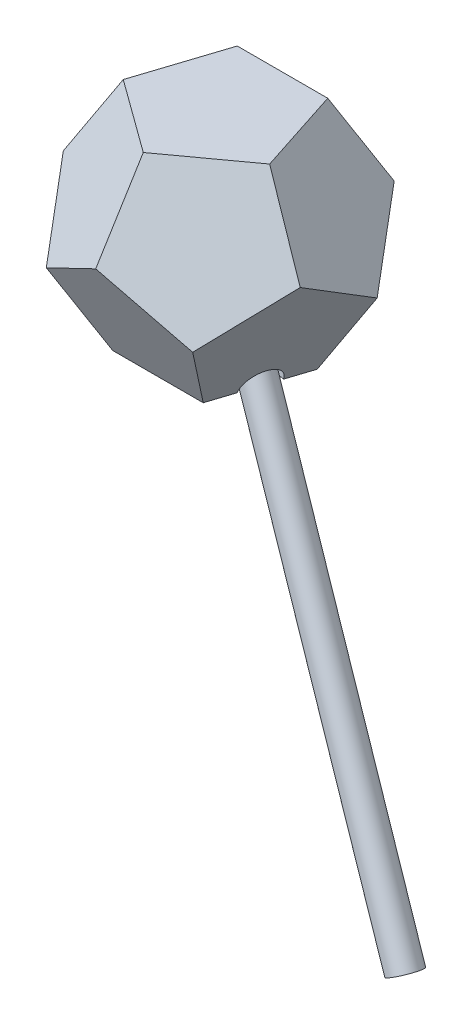
ISO-10303-21;
HEADER;
FILE_DESCRIPTION(('STEP AP214'),'2;1');
FILE_NAME('part.step','',(''),(''),'','','');
FILE_SCHEMA(('AUTOMOTIVE_DESIGN { 1 0 10303 214 1 1 1 1 }'));
ENDSEC;
DATA;
#1=APPLICATION_CONTEXT('core data for automotive mechanical design processes');
#2=APPLICATION_PROTOCOL_DEFINITION('international standard','automotive_design',2000,#1);
#3=PRODUCT_CONTEXT('',#1,'mechanical');
#4=PRODUCT('Part','Part','',(#3));
#5=PRODUCT_RELATED_PRODUCT_CATEGORY('part','',(#4));
#6=PRODUCT_DEFINITION_FORMATION('','',#4);
#7=PRODUCT_DEFINITION_CONTEXT('part definition',#1,'design');
#8=PRODUCT_DEFINITION('design','',#6,#7);
#9=PRODUCT_DEFINITION_SHAPE('','',#8);
#10=(LENGTH_UNIT() NAMED_UNIT(*) SI_UNIT(.MILLI.,.METRE.));
#11=(NAMED_UNIT(*) PLANE_ANGLE_UNIT() SI_UNIT($,.RADIAN.));
#12=(NAMED_UNIT(*) SI_UNIT($,.STERADIAN.) SOLID_ANGLE_UNIT());
#13=UNCERTAINTY_MEASURE_WITH_UNIT(LENGTH_MEASURE(1.E-05),#10,'distance_accuracy_value','');
#14=(GEOMETRIC_REPRESENTATION_CONTEXT(3) GLOBAL_UNCERTAINTY_ASSIGNED_CONTEXT((#13)) GLOBAL_UNIT_ASSIGNED_CONTEXT((#10,
#11,#12)) REPRESENTATION_CONTEXT('',''));
#15=CARTESIAN_POINT('',(0.,0.,0.));
#16=DIRECTION('',(0.,0.,1.));
#17=DIRECTION('',(1.,0.,0.));
#18=AXIS2_PLACEMENT_3D('',#15,#16,#17);
#19=CARTESIAN_POINT('',(-4.40860718489912,29.773572923928,-1.43244330732762));
#20=DIRECTION('',(0.499965060818532,-0.85067351211223,0.162448495688223));
#21=DIRECTION('',(0.862125098759777,0.506695484574754,0.));
#22=AXIS2_PLACEMENT_3D('',#19,#20,#21);
#23=PLANE('',#22);
#24=CARTESIAN_POINT('',(-4.40860718489912,29.773572923928,-1.43244330732762));
#25=DIRECTION('',(0.499965060818532,-0.85067351211223,0.162448495688223));
#26=DIRECTION('',(0.862125098759777,0.506695484574754,0.));
#27=AXIS2_PLACEMENT_3D('',#24,#25,#26);
#28=CIRCLE('',#27,4.05);
#29=CARTESIAN_POINT('',(-0.917000534922026,31.8256896364558,-1.43244330732762));
#30=VERTEX_POINT('',#29);
#31=EDGE_CURVE('E129',#30,#30,#28,.T.);
#32=ORIENTED_EDGE('',*,*,#31,.T.);
#33=EDGE_LOOP('',(#32));
#34=FACE_BOUND('',#33,.T.);
#35=CARTESIAN_POINT('',(-4.40860718489914,29.7735729239281,-1.43244330732762));
#36=DIRECTION('',(0.499965060818532,-0.850673512112229,0.162448495688223));
#37=DIRECTION('',(0.862125098759777,0.506695484574754,0.));
#38=AXIS2_PLACEMENT_3D('',#35,#36,#37);
#39=CIRCLE('',#38,3.29278811926631);
#40=CARTESIAN_POINT('',(-7.24740246741662,28.1051320522344,-1.43244330732762));
#41=VERTEX_POINT('',#40);
#42=EDGE_CURVE('E215',#41,#41,#39,.T.);
#43=ORIENTED_EDGE('',*,*,#42,.F.);
#44=EDGE_LOOP('',(#43));
#45=FACE_BOUND('',#44,.T.);
#46=ADVANCED_FACE('F37',(#34,#45),#23,.T.);
#47=CARTESIAN_POINT('',(16.1803398874989,0.,-5.25731112119136));
#48=DIRECTION('',(0.52570840560463,-0.447290848418711,-0.723575544913941));
#49=DIRECTION('',(-0.809016994374948,0.,-0.587785252292472));
#50=AXIS2_PLACEMENT_3D('',#47,#48,#49);
#51=PLANE('',#50);
#52=DIRECTION('',(-0.809065269261794,-0.525648973109098,-0.262881241521131));
#53=VECTOR('',#52,1.);
#54=CARTESIAN_POINT('',(8.09308247760691,22.2714192217847,-24.9005139598941));
#55=LINE('',#54,#53);
#56=CARTESIAN_POINT('',(16.1817960964732,27.5266491384143,-22.2723315879372));
#57=VERTEX_POINT('',#56);
#58=CARTESIAN_POINT('',(0.,17.0133508615857,-27.530115860106));
#59=VERTEX_POINT('',#58);
#60=EDGE_CURVE('E176',#57,#59,#55,.T.);
#61=ORIENTED_EDGE('',*,*,#60,.F.);
#62=DIRECTION('',(-0.500029835520881,0.525648973109087,-0.688232025307107));
#63=VECTOR('',#62,1.);
#64=CARTESIAN_POINT('',(29.2720315084894,13.7657326624709,-4.25516823212668));
#65=LINE('',#64,#63);
#66=CARTESIAN_POINT('',(26.1826960831143,17.0133508615857,-8.50727365788405));
#67=VERTEX_POINT('',#66);
#68=EDGE_CURVE('E180',#67,#57,#65,.T.);
#69=ORIENTED_EDGE('',*,*,#68,.F.);
#70=DIRECTION('',(-0.500078121722083,-0.850600036298457,0.162485231402662));
#71=VECTOR('',#70,1.);
#72=CARTESIAN_POINT('',(16.1803398874989,0.,-5.25731112119136));
#73=LINE('',#72,#71);
#74=CARTESIAN_POINT('',(16.1803398874989,0.,-5.25731112119136));
#75=VERTEX_POINT('',#74);
#76=EDGE_CURVE('E138',#67,#75,#73,.T.);
#77=ORIENTED_EDGE('',*,*,#76,.T.);
#78=DIRECTION('',(-0.809016994374948,0.,-0.587785252292472));
#79=VECTOR('',#78,1.);
#80=CARTESIAN_POINT('',(16.1803398874989,0.,-5.25731112119136));
#81=LINE('',#80,#79);
#82=CARTESIAN_POINT('',(0.,0.,-17.0130161670408));
#83=VERTEX_POINT('',#82);
#84=EDGE_CURVE('E135',#75,#83,#81,.T.);
#85=ORIENTED_EDGE('',*,*,#84,.T.);
#86=DIRECTION('',(0.,-0.850600036298457,0.525813254158796));
#87=VECTOR('',#86,1.);
#88=CARTESIAN_POINT('',(0.,0.,-17.0130161670408));
#89=LINE('',#88,#87);
#90=EDGE_CURVE('E45',#59,#83,#89,.T.);
#91=ORIENTED_EDGE('',*,*,#90,.F.);
#92=EDGE_LOOP('',(#61,#69,#77,#85,#91));
#93=FACE_BOUND('',#92,.T.);
#94=ADVANCED_FACE('F230',(#93),#51,.T.);
#95=CARTESIAN_POINT('',(0.,0.,-17.0130161670408));
#96=DIRECTION('',(-0.525708405604632,-0.447290848418711,-0.72357554491394));
#97=DIRECTION('',(-0.809016994374947,0.,0.587785252292474));
#98=AXIS2_PLACEMENT_3D('',#95,#96,#97);
#99=PLANE('',#98);
#100=DIRECTION('',(-0.500029835520869,-0.525648973109098,0.688232025307108));
#101=VECTOR('',#100,1.);
#102=CARTESIAN_POINT('',(-21.1808960381971,22.2714192217847,-15.3916608095201));
#103=LINE('',#102,#101);
#104=CARTESIAN_POINT('',(-16.1817960964736,27.5266491384143,-22.2723315879368));
#105=VERTEX_POINT('',#104);
#106=CARTESIAN_POINT('',(-26.1826960831143,17.0133508615857,-8.50727365788398));
#107=VERTEX_POINT('',#106);
#108=EDGE_CURVE('E173',#105,#107,#103,.T.);
#109=ORIENTED_EDGE('',*,*,#108,.F.);
#110=DIRECTION('',(-0.809065269261797,0.525648973109087,0.262881241521143));
#111=VECTOR('',#110,1.);
#112=CARTESIAN_POINT('',(4.99864972090595,13.765732662471,-29.1542756089975));
#113=LINE('',#112,#111);
#114=EDGE_CURVE('E178',#59,#105,#113,.T.);
#115=ORIENTED_EDGE('',*,*,#114,.F.);
#116=ORIENTED_EDGE('',*,*,#90,.T.);
#117=DIRECTION('',(-0.809016994374947,0.,0.587785252292474));
#118=VECTOR('',#117,1.);
#119=CARTESIAN_POINT('',(0.,0.,-17.0130161670408));
#120=LINE('',#119,#118);
#121=CARTESIAN_POINT('',(-16.180339887499,0.,-5.25731112119131));
#122=VERTEX_POINT('',#121);
#123=EDGE_CURVE('E163',#83,#122,#120,.T.);
#124=ORIENTED_EDGE('',*,*,#123,.T.);
#125=DIRECTION('',(0.500078121722083,-0.850600036298458,0.162485231402661));
#126=VECTOR('',#125,1.);
#127=CARTESIAN_POINT('',(-16.180339887499,0.,-5.25731112119131));
#128=LINE('',#127,#126);
#129=EDGE_CURVE('E145',#107,#122,#128,.T.);
#130=ORIENTED_EDGE('',*,*,#129,.F.);
#131=EDGE_LOOP('',(#109,#115,#116,#124,#130));
#132=FACE_BOUND('',#131,.T.);
#133=ADVANCED_FACE('F39',(#132),#99,.T.);
#134=CARTESIAN_POINT('',(-16.180339887499,0.,-5.25731112119131));
#135=DIRECTION('',(-0.850614068439808,-0.447290848418711,0.2763812647289));
#136=DIRECTION('',(0.465419848908712,-0.8850900317153,0.));
#137=AXIS2_PLACEMENT_3D('',#134,#135,#136);
#138=PLANE('',#137);
#139=DIRECTION('',(0.500029835520878,-0.525648973109097,0.688232025307102));
#140=VECTOR('',#139,1.);
#141=CARTESIAN_POINT('',(-21.1835961413907,22.2714192217847,15.387944436301));
#142=LINE('',#141,#140);
#143=CARTESIAN_POINT('',(-26.1826960831142,27.5266491384143,8.50727365788428));
#144=VERTEX_POINT('',#143);
#145=CARTESIAN_POINT('',(-16.1817960964734,17.0133508615857,22.272331587937));
#146=VERTEX_POINT('',#145);
#147=EDGE_CURVE('E169',#144,#146,#142,.T.);
#148=ORIENTED_EDGE('',*,*,#147,.F.);
#149=DIRECTION('',(0.,0.525648973109087,0.850701567571944));
#150=VECTOR('',#149,1.);
#151=CARTESIAN_POINT('',(-26.1826960831144,13.765732662471,-13.7631650116158));
#152=LINE('',#151,#150);
#153=EDGE_CURVE('E160',#107,#144,#152,.T.);
#154=ORIENTED_EDGE('',*,*,#153,.F.);
#155=ORIENTED_EDGE('',*,*,#129,.T.);
#156=DIRECTION('',(0.309016994374949,0.,0.951056516295153));
#157=VECTOR('',#156,1.);
#158=CARTESIAN_POINT('',(-16.180339887499,0.,-5.25731112119131));
#159=LINE('',#158,#157);
#160=CARTESIAN_POINT('',(-9.99999999999998,0.,13.7638192047118));
#161=VERTEX_POINT('',#160);
#162=EDGE_CURVE('E140',#122,#161,#159,.T.);
#163=ORIENTED_EDGE('',*,*,#162,.T.);
#164=DIRECTION('',(0.309065276254454,-0.850600036298457,-0.42539185848206));
#165=VECTOR('',#164,1.);
#166=CARTESIAN_POINT('',(-9.99999999999998,0.,13.7638192047118));
#167=LINE('',#166,#165);
#168=EDGE_CURVE('E149',#146,#161,#167,.T.);
#169=ORIENTED_EDGE('',*,*,#168,.F.);
#170=EDGE_LOOP('',(#148,#154,#155,#163,#169));
#171=FACE_BOUND('',#170,.T.);
#172=ADVANCED_FACE('F156',(#171),#138,.T.);
#173=CARTESIAN_POINT('',(-9.99999999999998,0.,13.7638192047118));
#174=DIRECTION('',(0.,-0.447290848418711,0.894388560370083));
#175=DIRECTION('',(0.,-0.894388560370083,-0.447290848418711));
#176=AXIS2_PLACEMENT_3D('',#173,#174,#175);
#177=PLANE('',#176);
#178=DIRECTION('',(0.8090652692618,0.525648973109087,0.262881241521133));
#179=VECTOR('',#178,1.);
#180=CARTESIAN_POINT('',(-21.1804458173794,13.7657326624709,20.6481718390456));
#181=LINE('',#180,#179);
#182=CARTESIAN_POINT('',(2.82325570167555E-13,27.5266491384143,27.530115860106));
#183=VERTEX_POINT('',#182);
#184=EDGE_CURVE('E171',#146,#183,#181,.T.);
#185=ORIENTED_EDGE('',*,*,#184,.F.);
#186=ORIENTED_EDGE('',*,*,#168,.T.);
#187=DIRECTION('',(1.,0.,0.));
#188=VECTOR('',#187,1.);
#189=CARTESIAN_POINT('',(-9.99999999999998,0.,13.7638192047118));
#190=LINE('',#189,#188);
#191=CARTESIAN_POINT('',(10.,0.,13.7638192047117));
#192=VERTEX_POINT('',#191);
#193=EDGE_CURVE('E136',#161,#192,#190,.T.);
#194=ORIENTED_EDGE('',*,*,#193,.T.);
#195=DIRECTION('',(-0.309065276254455,-0.850600036298457,-0.425391858482059));
#196=VECTOR('',#195,1.);
#197=CARTESIAN_POINT('',(10.,0.,13.7638192047117));
#198=LINE('',#197,#196);
#199=CARTESIAN_POINT('',(16.1817960964734,17.0133508615857,22.272331587937));
#200=VERTEX_POINT('',#199);
#201=EDGE_CURVE('E147',#200,#192,#198,.T.);
#202=ORIENTED_EDGE('',*,*,#201,.F.);
#203=DIRECTION('',(0.809065269261791,-0.525648973109097,-0.262881241521141));
#204=VECTOR('',#203,1.);
#205=CARTESIAN_POINT('',(8.0887136188665,22.2714192217847,24.9019334881489));
#206=LINE('',#205,#204);
#207=EDGE_CURVE('E58',#183,#200,#206,.T.);
#208=ORIENTED_EDGE('',*,*,#207,.F.);
#209=EDGE_LOOP('',(#185,#186,#194,#202,#208));
#210=FACE_BOUND('',#209,.T.);
#211=ADVANCED_FACE('F270',(#210),#177,.T.);
#212=CARTESIAN_POINT('',(10.,0.,13.7638192047117));
#213=DIRECTION('',(0.850614068439809,-0.447290848418711,0.276381264728898));
#214=DIRECTION('',(0.465419848908712,0.885090031715301,0.));
#215=AXIS2_PLACEMENT_3D('',#212,#213,#214);
#216=PLANE('',#215);
#217=DIRECTION('',(0.309016994374946,0.,-0.951056516295154));
#218=VECTOR('',#217,1.);
#219=CARTESIAN_POINT('',(10.,0.,13.7638192047117));
#220=LINE('',#219,#218);
#221=CARTESIAN_POINT('',(11.838651116531,0.,8.10503293275556));
#222=VERTEX_POINT('',#221);
#223=EDGE_CURVE('E127',#192,#222,#220,.T.);
#224=ORIENTED_EDGE('',*,*,#223,.T.);
#225=CARTESIAN_POINT('',(13.0901699437495,0.,4.25325404176018));
#226=DIRECTION('',(0.850614068439809,-0.447290848418711,0.276381264728898));
#227=DIRECTION('',(-0.425398876067803,-0.894388560370083,-0.13822047358977));
#228=AXIS2_PLACEMENT_3D('',#225,#226,#227);
#229=ELLIPSE('',#228,4.76093347486959,4.05);
#230=CARTESIAN_POINT('',(14.341688770968,0.,0.401475150764812));
#231=VERTEX_POINT('',#230);
#232=EDGE_CURVE('E51',#222,#231,#229,.F.);
#233=ORIENTED_EDGE('',*,*,#232,.T.);
#234=EDGE_CURVE('E125',#231,#75,#220,.T.);
#235=ORIENTED_EDGE('',*,*,#234,.T.);
#236=ORIENTED_EDGE('',*,*,#76,.F.);
#237=DIRECTION('',(0.,-0.525648973109097,-0.850701567571937));
#238=VECTOR('',#237,1.);
#239=CARTESIAN_POINT('',(26.1826960831144,22.2714192217847,0.00229684496430398));
#240=LINE('',#239,#238);
#241=CARTESIAN_POINT('',(26.1826960831144,27.5266491384143,8.50727365788375));
#242=VERTEX_POINT('',#241);
#243=EDGE_CURVE('E182',#242,#67,#240,.T.);
#244=ORIENTED_EDGE('',*,*,#243,.F.);
#245=DIRECTION('',(0.500029835520873,0.525648973109087,-0.688232025307113));
#246=VECTOR('',#245,1.);
#247=CARTESIAN_POINT('',(13.0924606710984,13.7657326624709,26.5244370136944));
#248=LINE('',#247,#246);
#249=EDGE_CURVE('E185',#200,#242,#248,.T.);
#250=ORIENTED_EDGE('',*,*,#249,.F.);
#251=ORIENTED_EDGE('',*,*,#201,.T.);
#252=EDGE_LOOP('',(#224,#233,#235,#236,#244,#250,#251));
#253=FACE_BOUND('',#252,.T.);
#254=ADVANCED_FACE('F123',(#253),#216,.T.);
#255=CARTESIAN_POINT('',(0.,0.,0.));
#256=DIRECTION('',(0.,1.,0.));
#257=DIRECTION('',(0.,0.,1.));
#258=AXIS2_PLACEMENT_3D('',#255,#256,#257);
#259=PLANE('',#258);
#260=ORIENTED_EDGE('',*,*,#234,.F.);
#261=CARTESIAN_POINT('',(13.0901699437495,0.,4.25325404176018));
#262=DIRECTION('',(0.,1.,0.));
#263=DIRECTION('',(0.951056516295154,0.,0.309016994374946));
#264=AXIS2_PLACEMENT_3D('',#261,#262,#263);
#265=ELLIPSE('',#264,4.76093347486959,4.05);
#266=EDGE_CURVE('E12',#231,#222,#265,.T.);
#267=ORIENTED_EDGE('',*,*,#266,.T.);
#268=ORIENTED_EDGE('',*,*,#223,.F.);
#269=ORIENTED_EDGE('',*,*,#193,.F.);
#270=ORIENTED_EDGE('',*,*,#162,.F.);
#271=ORIENTED_EDGE('',*,*,#123,.F.);
#272=ORIENTED_EDGE('',*,*,#84,.F.);
#273=EDGE_LOOP('',(#260,#267,#268,#269,#270,#271,#272));
#274=FACE_BOUND('',#273,.T.);
#275=ADVANCED_FACE('F132',(#274),#259,.F.);
#276=CARTESIAN_POINT('',(-16.1803398874989,44.54,5.25731112119151));
#277=DIRECTION('',(0.525708405604624,-0.447290848418711,-0.723575544913946));
#278=DIRECTION('',(-0.809016994374953,0.,-0.587785252292465));
#279=AXIS2_PLACEMENT_3D('',#276,#277,#278);
#280=PLANE('',#279);
#281=ORIENTED_EDGE('',*,*,#147,.T.);
#282=ORIENTED_EDGE('',*,*,#184,.T.);
#283=DIRECTION('',(0.,0.850600036298457,-0.525813254158796));
#284=VECTOR('',#283,1.);
#285=CARTESIAN_POINT('',(1.42247325030098E-13,49.7978187040126,13.762803793944));
#286=LINE('',#285,#284);
#287=CARTESIAN_POINT('',(1.75207071073658E-13,44.54,17.0130161670408));
#288=VERTEX_POINT('',#287);
#289=EDGE_CURVE('E192',#183,#288,#286,.T.);
#290=ORIENTED_EDGE('',*,*,#289,.T.);
#291=DIRECTION('',(0.809016994374953,0.,0.587785252292465));
#292=VECTOR('',#291,1.);
#293=CARTESIAN_POINT('',(-16.1803398874989,44.54,5.25731112119151));
#294=LINE('',#293,#292);
#295=CARTESIAN_POINT('',(-16.1803398874989,44.54,5.25731112119151));
#296=VERTEX_POINT('',#295);
#297=EDGE_CURVE('E128',#296,#288,#294,.T.);
#298=ORIENTED_EDGE('',*,*,#297,.F.);
#299=DIRECTION('',(0.500078121722081,0.850600036298457,-0.162485231402667));
#300=VECTOR('',#299,1.);
#301=CARTESIAN_POINT('',(-13.089204230722,49.7978187040126,4.25294026257682));
#302=LINE('',#301,#300);
#303=EDGE_CURVE('E187',#144,#296,#302,.T.);
#304=ORIENTED_EDGE('',*,*,#303,.F.);
#305=EDGE_LOOP('',(#281,#282,#290,#298,#304));
#306=FACE_BOUND('',#305,.T.);
#307=ADVANCED_FACE('F244',(#306),#280,.F.);
#308=CARTESIAN_POINT('',(-10.0000000000001,44.54,-13.7638192047116));
#309=DIRECTION('',(0.850614068439812,-0.447290848418711,0.27638126472889));
#310=DIRECTION('',(0.465419848908711,0.885090031715301,0.));
#311=AXIS2_PLACEMENT_3D('',#308,#309,#310);
#312=PLANE('',#311);
#313=ORIENTED_EDGE('',*,*,#108,.T.);
#314=ORIENTED_EDGE('',*,*,#153,.T.);
#315=ORIENTED_EDGE('',*,*,#303,.T.);
#316=DIRECTION('',(-0.309016994374937,0.,0.951056516295157));
#317=VECTOR('',#316,1.);
#318=CARTESIAN_POINT('',(-10.0000000000001,44.54,-13.7638192047116));
#319=LINE('',#318,#317);
#320=CARTESIAN_POINT('',(-10.0000000000001,44.54,-13.7638192047116));
#321=VERTEX_POINT('',#320);
#322=EDGE_CURVE('E198',#321,#296,#319,.T.);
#323=ORIENTED_EDGE('',*,*,#322,.F.);
#324=DIRECTION('',(0.309065276254459,0.850600036298457,0.425391858482056));
#325=VECTOR('',#324,1.);
#326=CARTESIAN_POINT('',(-8.08957310027528,49.7978187040126,-11.1343421595486));
#327=LINE('',#326,#325);
#328=EDGE_CURVE('E194',#105,#321,#327,.T.);
#329=ORIENTED_EDGE('',*,*,#328,.F.);
#330=EDGE_LOOP('',(#313,#314,#315,#323,#329));
#331=FACE_BOUND('',#330,.T.);
#332=ADVANCED_FACE('F247',(#331),#312,.F.);
#333=CARTESIAN_POINT('',(9.99999999999986,44.54,-13.7638192047118));
#334=DIRECTION('',(0.,-0.447290848418711,0.894388560370083));
#335=DIRECTION('',(0.,-0.894388560370083,-0.447290848418711));
#336=AXIS2_PLACEMENT_3D('',#333,#334,#335);
#337=PLANE('',#336);
#338=ORIENTED_EDGE('',*,*,#60,.T.);
#339=ORIENTED_EDGE('',*,*,#114,.T.);
#340=ORIENTED_EDGE('',*,*,#328,.T.);
#341=DIRECTION('',(-1.,0.,0.));
#342=VECTOR('',#341,1.);
#343=CARTESIAN_POINT('',(9.99999999999986,44.54,-13.7638192047118));
#344=LINE('',#343,#342);
#345=CARTESIAN_POINT('',(9.99999999999986,44.54,-13.7638192047118));
#346=VERTEX_POINT('',#345);
#347=EDGE_CURVE('E201',#346,#321,#344,.T.);
#348=ORIENTED_EDGE('',*,*,#347,.F.);
#349=DIRECTION('',(-0.30906527625445,0.850600036298457,0.425391858482063));
#350=VECTOR('',#349,1.);
#351=CARTESIAN_POINT('',(8.08957310027504,49.7978187040126,-11.1343421595488));
#352=LINE('',#351,#350);
#353=EDGE_CURVE('E191',#57,#346,#352,.T.);
#354=ORIENTED_EDGE('',*,*,#353,.F.);
#355=EDGE_LOOP('',(#338,#339,#340,#348,#354));
#356=FACE_BOUND('',#355,.T.);
#357=ADVANCED_FACE('F251',(#356),#337,.F.);
#358=CARTESIAN_POINT('',(16.180339887499,44.54,5.25731112119117));
#359=DIRECTION('',(-0.850614068439806,-0.447290848418711,0.276381264728908));
#360=DIRECTION('',(0.465419848908713,-0.8850900317153,0.));
#361=AXIS2_PLACEMENT_3D('',#358,#359,#360);
#362=PLANE('',#361);
#363=ORIENTED_EDGE('',*,*,#68,.T.);
#364=ORIENTED_EDGE('',*,*,#353,.T.);
#365=DIRECTION('',(-0.309016994374957,0.,-0.951056516295151));
#366=VECTOR('',#365,1.);
#367=CARTESIAN_POINT('',(16.180339887499,44.54,5.25731112119117));
#368=LINE('',#367,#366);
#369=CARTESIAN_POINT('',(16.180339887499,44.54,5.25731112119117));
#370=VERTEX_POINT('',#369);
#371=EDGE_CURVE('E204',#370,#346,#368,.T.);
#372=ORIENTED_EDGE('',*,*,#371,.F.);
#373=DIRECTION('',(-0.500078121722085,0.850600036298458,-0.162485231402656));
#374=VECTOR('',#373,1.);
#375=CARTESIAN_POINT('',(13.0892042307221,49.7978187040126,4.25294026257655));
#376=LINE('',#375,#374);
#377=EDGE_CURVE('E188',#242,#370,#376,.T.);
#378=ORIENTED_EDGE('',*,*,#377,.F.);
#379=ORIENTED_EDGE('',*,*,#243,.T.);
#380=EDGE_LOOP('',(#363,#364,#372,#378,#379));
#381=FACE_BOUND('',#380,.T.);
#382=ADVANCED_FACE('F255',(#381),#362,.F.);
#383=CARTESIAN_POINT('',(1.75207071073658E-13,44.54,17.0130161670408));
#384=DIRECTION('',(-0.525708405604639,-0.447290848418711,-0.723575544913935));
#385=DIRECTION('',(-0.809016994374941,0.,0.587785252292482));
#386=AXIS2_PLACEMENT_3D('',#383,#384,#385);
#387=PLANE('',#386);
#388=ORIENTED_EDGE('',*,*,#207,.T.);
#389=ORIENTED_EDGE('',*,*,#249,.T.);
#390=ORIENTED_EDGE('',*,*,#377,.T.);
#391=DIRECTION('',(0.809016994374941,0.,-0.587785252292482));
#392=VECTOR('',#391,1.);
#393=CARTESIAN_POINT('',(1.75207071073658E-13,44.54,17.0130161670408));
#394=LINE('',#393,#392);
#395=EDGE_CURVE('E207',#288,#370,#394,.T.);
#396=ORIENTED_EDGE('',*,*,#395,.F.);
#397=ORIENTED_EDGE('',*,*,#289,.F.);
#398=EDGE_LOOP('',(#388,#389,#390,#396,#397));
#399=FACE_BOUND('',#398,.T.);
#400=ADVANCED_FACE('F259',(#399),#387,.F.);
#401=CARTESIAN_POINT('',(0.,44.54,0.));
#402=DIRECTION('',(0.,1.,0.));
#403=DIRECTION('',(0.,0.,1.));
#404=AXIS2_PLACEMENT_3D('',#401,#402,#403);
#405=PLANE('',#404);
#406=ORIENTED_EDGE('',*,*,#322,.T.);
#407=ORIENTED_EDGE('',*,*,#297,.T.);
#408=ORIENTED_EDGE('',*,*,#395,.T.);
#409=ORIENTED_EDGE('',*,*,#371,.T.);
#410=ORIENTED_EDGE('',*,*,#347,.T.);
#411=EDGE_LOOP('',(#406,#407,#408,#409,#410));
#412=FACE_BOUND('',#411,.T.);
#413=ADVANCED_FACE('F242',(#412),#405,.T.);
#414=CARTESIAN_POINT('',(-4.40860718489912,29.773572923928,-1.43244330732762));
#415=DIRECTION('',(0.499965060818532,-0.85067351211223,0.162448495688223));
#416=DIRECTION('',(0.862125098759777,0.506695484574754,0.));
#417=AXIS2_PLACEMENT_3D('',#414,#415,#416);
#418=CYLINDRICAL_SURFACE('',#417,4.05);
#419=ORIENTED_EDGE('',*,*,#31,.F.);
#420=EDGE_LOOP('',(#419));
#421=FACE_BOUND('',#420,.T.);
#422=ORIENTED_EDGE('',*,*,#266,.F.);
#423=ORIENTED_EDGE('',*,*,#232,.F.);
#424=EDGE_LOOP('',(#422,#423));
#425=FACE_BOUND('',#424,.T.);
#426=ADVANCED_FACE('F117',(#421,#425),#418,.F.);
#427=CARTESIAN_POINT('',(60.58685072151,-80.8139836506618,19.6858611321414));
#428=DIRECTION('',(-0.499965060818532,0.850673512112229,-0.162448495688223));
#429=DIRECTION('',(-0.862125098759777,-0.506695484574754,0.));
#430=AXIS2_PLACEMENT_3D('',#427,#428,#429);
#431=CYLINDRICAL_SURFACE('',#430,3.29278811926631);
#432=CARTESIAN_POINT('',(60.58685072151,-80.8139836506618,19.6858611321414));
#433=DIRECTION('',(0.499965060818532,-0.850673512112229,0.162448495688223));
#434=DIRECTION('',(0.862125098759777,0.506695484574754,0.));
#435=AXIS2_PLACEMENT_3D('',#432,#433,#434);
#436=CIRCLE('',#435,3.29278811926631);
#437=CARTESIAN_POINT('',(57.7480554389925,-82.4824245223554,19.6858611321414));
#438=VERTEX_POINT('',#437);
#439=EDGE_CURVE('E214',#438,#438,#436,.T.);
#440=CARTESIAN_POINT('',(57.7480554389925,-82.4824245223554,19.6858611321414));
#441=CARTESIAN_POINT('',(57.0710194191341,-81.3304708080368,19.4658787942302));
#442=CARTESIAN_POINT('',(56.3939833992756,-80.1785170937181,19.2458964563191));
#443=CARTESIAN_POINT('',(55.0399113595588,-77.8746096650808,18.8059317804968));
#444=CARTESIAN_POINT('',(54.3628753397003,-76.7226559507622,18.5859494425857));
#445=CARTESIAN_POINT('',(53.0088032999835,-74.4187485221249,18.1459847667634));
#446=CARTESIAN_POINT('',(52.3317672801251,-73.2667948078063,17.9260024288523));
#447=CARTESIAN_POINT('',(50.9776952404082,-70.962887379169,17.48603775303));
#448=CARTESIAN_POINT('',(50.3006592205498,-69.8109336648503,17.2660554151189));
#449=CARTESIAN_POINT('',(48.9465871808329,-67.5070262362131,16.8260907392966));
#450=CARTESIAN_POINT('',(48.2695511609745,-66.3550725218944,16.6061084013855));
#451=CARTESIAN_POINT('',(46.9154791212576,-64.0511650932571,16.1661437255632));
#452=CARTESIAN_POINT('',(46.2384431013992,-62.8992113789385,15.9461613876521));
#453=CARTESIAN_POINT('',(44.8843710616824,-60.5953039503012,15.5061967118298));
#454=CARTESIAN_POINT('',(44.2073350418239,-59.4433502359825,15.2862143739187));
#455=CARTESIAN_POINT('',(42.8532630021071,-57.1394428073453,14.8462496980964));
#456=CARTESIAN_POINT('',(42.1762269822486,-55.9874890930266,14.6262673601852));
#457=CARTESIAN_POINT('',(40.8221549425318,-53.6835816643893,14.186302684363));
#458=CARTESIAN_POINT('',(40.1451189226733,-52.5316279500707,13.9663203464518));
#459=CARTESIAN_POINT('',(38.7910468829565,-50.2277205214334,13.5263556706296));
#460=CARTESIAN_POINT('',(38.1140108630981,-49.0757668071147,13.3063733327184));
#461=CARTESIAN_POINT('',(36.7599388233812,-46.7718593784775,12.8664086568962));
#462=CARTESIAN_POINT('',(36.0829028035228,-45.6199056641588,12.646426318985));
#463=CARTESIAN_POINT('',(34.7288307638059,-43.3159982355215,12.2064616431628));
#464=CARTESIAN_POINT('',(34.0517947439475,-42.1640445212029,11.9864793052516));
#465=CARTESIAN_POINT('',(32.6977227042306,-39.8601370925656,11.5465146294294));
#466=CARTESIAN_POINT('',(32.0206866843722,-38.708183378247,11.3265322915182));
#467=CARTESIAN_POINT('',(30.6666146446554,-36.4042759496097,10.8865676156959));
#468=CARTESIAN_POINT('',(29.9895786247969,-35.252322235291,10.6665852777848));
#469=CARTESIAN_POINT('',(28.6355065850801,-32.9484148066537,10.2266206019625));
#470=CARTESIAN_POINT('',(27.9584705652216,-31.7964610923351,10.0066382640514));
#471=CARTESIAN_POINT('',(26.6043985255048,-29.4925536636978,9.56667358822913));
#472=CARTESIAN_POINT('',(25.9273625056464,-28.3405999493792,9.346691250318));
#473=CARTESIAN_POINT('',(24.5732904659295,-26.0366925207419,8.90672657449573));
#474=CARTESIAN_POINT('',(23.8962544460711,-24.8847388064232,8.68674423658459));
#475=CARTESIAN_POINT('',(22.5421824063542,-22.5808313777859,8.24677956076233));
#476=CARTESIAN_POINT('',(21.8651463864958,-21.4288776634673,8.02679722285119));
#477=CARTESIAN_POINT('',(20.5110743467789,-19.12497023483,7.58683254702892));
#478=CARTESIAN_POINT('',(19.8340383269205,-17.9730165205114,7.36685020911778));
#479=CARTESIAN_POINT('',(18.4799662872036,-15.6691090918741,6.92688553329551));
#480=CARTESIAN_POINT('',(17.8029302673452,-14.5171553775554,6.70690319538438));
#481=CARTESIAN_POINT('',(16.4488582276284,-12.2132479489181,6.26693851956211));
#482=CARTESIAN_POINT('',(15.7718222077699,-11.0612942345995,6.04695618165097));
#483=CARTESIAN_POINT('',(14.4177501680531,-8.7573868059622,5.6069915058287));
#484=CARTESIAN_POINT('',(13.7407141481946,-7.60543309164355,5.38700916791757));
#485=CARTESIAN_POINT('',(12.3866421084778,-5.30152566300626,4.9470444920953));
#486=CARTESIAN_POINT('',(11.7096060886194,-4.14957194868762,4.72706215418416));
#487=CARTESIAN_POINT('',(10.3555340489025,-1.84566452005033,4.28709747836189));
#488=CARTESIAN_POINT('',(9.67849802904408,-0.69371080573169,4.06711514045076));
#489=CARTESIAN_POINT('',(8.32442598932723,1.6101966229056,3.62715046462849));
#490=CARTESIAN_POINT('',(7.6473899694688,2.76215033722424,3.40716812671735));
#491=CARTESIAN_POINT('',(6.29331792975195,5.06605776586153,2.96720345089508));
#492=CARTESIAN_POINT('',(5.61628190989352,6.21801148018017,2.74722111298395));
#493=CARTESIAN_POINT('',(4.26220987017666,8.52191890881745,2.30725643716168));
#494=CARTESIAN_POINT('',(3.58517385031823,9.6738726231361,2.08727409925054));
#495=CARTESIAN_POINT('',(2.23110181060137,11.9777800517734,1.64730942342827));
#496=CARTESIAN_POINT('',(1.55406579074294,13.129733766092,1.42732708551714));
#497=CARTESIAN_POINT('',(0.19999375102609,15.4336411947293,0.987362409694865));
#498=CARTESIAN_POINT('',(-0.477042268832341,16.585594909048,0.767380071783728));
#499=CARTESIAN_POINT('',(-1.8311143085492,18.8895023376852,0.327415395961456));
#500=CARTESIAN_POINT('',(-2.50815032840763,20.0414560520039,0.10743305805032));
#501=CARTESIAN_POINT('',(-3.86222236812448,22.3453634806412,-0.332531617771949));
#502=CARTESIAN_POINT('',(-4.5392583879829,23.4973171949598,-0.552513955683082));
#503=CARTESIAN_POINT('',(-5.89333042769976,25.8012246235971,-0.992478631505351));
#504=CARTESIAN_POINT('',(-6.57036644755819,26.9531783379157,-1.21246096941649));
#505=CARTESIAN_POINT('',(-7.24740246741662,28.1051320522344,-1.43244330732762));
#506=B_SPLINE_CURVE_WITH_KNOTS('',3,(#440,#441,#442,#443,#444,#445,#446,#447,#448,#449,#450,
#451,#452,#453,#454,#455,#456,#457,#458,#459,#460,#461,#462,#463,#464,#465,#466,#467,#468,#469,
#470,#471,#472,#473,#474,#475,#476,#477,#478,#479,#480,#481,#482,#483,#484,#485,#486,#487,#488,
#489,#490,#491,#492,#493,#494,#495,#496,#497,#498,#499,#500,#501,#502,#503,#504,#505),
.UNSPECIFIED.,.F.,.F.,(4,2,2,2,2,2,2,2,2,2,2,2,2,2,2,2,2,2,2,2,2,2,2,2,2,2,2,2,2,2,2,2,4),(0.,
4.06249999999999,8.12499999999999,12.1875,16.25,20.3125,24.375,28.4375,32.5,36.5625,40.625,
44.6875,48.75,52.8125,56.875,60.9375,65.,69.0625,73.125,77.1875,81.25,85.3125,89.375,93.4375,
97.5,101.5625,105.625,109.6875,113.75,117.8125,121.875,125.9375,130.),.UNSPECIFIED.);
#507=EDGE_CURVE('BSEAM223',#438,#41,#506,.T.);
#508=ORIENTED_EDGE('',*,*,#439,.F.);
#509=ORIENTED_EDGE('',*,*,#42,.T.);
#510=ORIENTED_EDGE('',*,*,#507,.T.);
#511=ORIENTED_EDGE('',*,*,#507,.F.);
#512=EDGE_LOOP('',(#508,#510,#509,#511));
#513=FACE_BOUND('',#512,.T.);
#514=ADVANCED_FACE('F223',(#513),#431,.T.);
#515=CARTESIAN_POINT('',(60.58685072151,-80.8139836506618,19.6858611321414));
#516=DIRECTION('',(0.499965060818532,-0.850673512112229,0.162448495688223));
#517=DIRECTION('',(0.862125098759777,0.506695484574754,0.));
#518=AXIS2_PLACEMENT_3D('',#515,#516,#517);
#519=PLANE('',#518);
#520=ORIENTED_EDGE('',*,*,#439,.T.);
#521=EDGE_LOOP('',(#520));
#522=FACE_BOUND('',#521,.T.);
#523=ADVANCED_FACE('F221',(#522),#519,.T.);
#524=CLOSED_SHELL('',(#46,#94,#133,#172,#211,#254,#275,#307,#332,#357,#382,#400,#413,#426,#514,#523));
#525=MANIFOLD_SOLID_BREP('B2',#524);
#526=ADVANCED_BREP_SHAPE_REPRESENTATION('',(#18,#525),#14);
#527=SHAPE_DEFINITION_REPRESENTATION(#9,#526);
ENDSEC;
END-ISO-10303-21;
